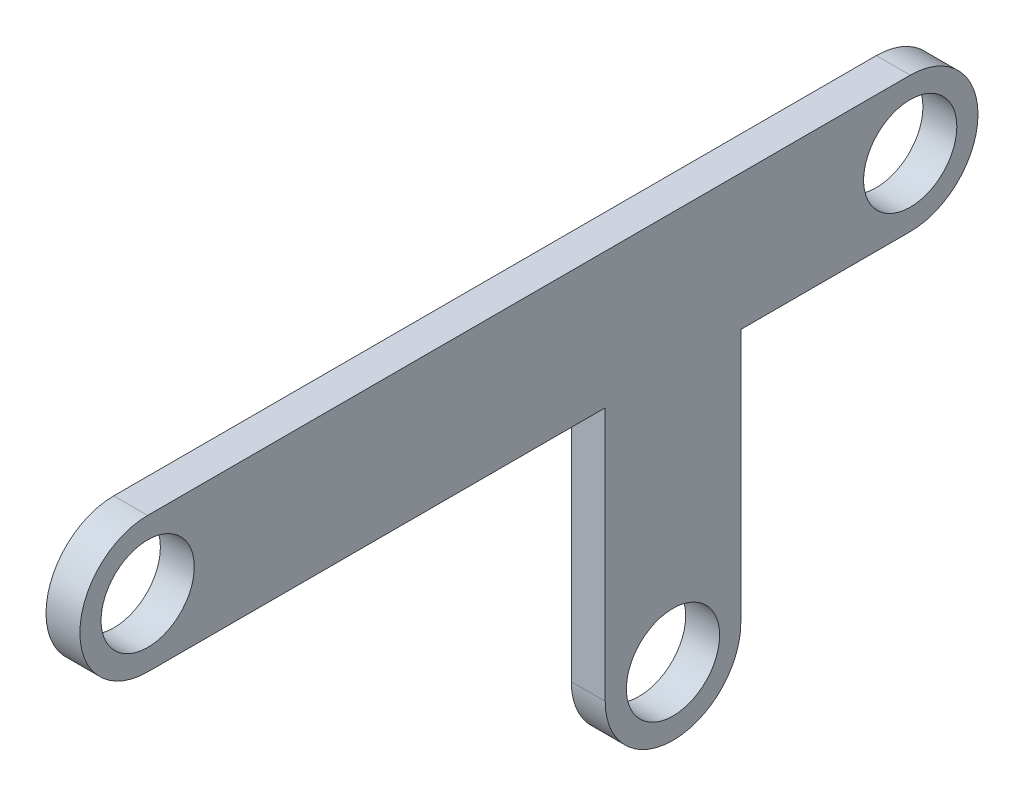
ISO-10303-21;
HEADER;
FILE_DESCRIPTION(('STEP AP214'),'2;1');
FILE_NAME('part.step','',(''),(''),'','','');
FILE_SCHEMA(('AUTOMOTIVE_DESIGN { 1 0 10303 214 1 1 1 1 }'));
ENDSEC;
DATA;
#1=APPLICATION_CONTEXT('core data for automotive mechanical design processes');
#2=APPLICATION_PROTOCOL_DEFINITION('international standard','automotive_design',2000,#1);
#3=PRODUCT_CONTEXT('',#1,'mechanical');
#4=PRODUCT('Part','Part','',(#3));
#5=PRODUCT_RELATED_PRODUCT_CATEGORY('part','',(#4));
#6=PRODUCT_DEFINITION_FORMATION('','',#4);
#7=PRODUCT_DEFINITION_CONTEXT('part definition',#1,'design');
#8=PRODUCT_DEFINITION('design','',#6,#7);
#9=PRODUCT_DEFINITION_SHAPE('','',#8);
#10=(LENGTH_UNIT() NAMED_UNIT(*) SI_UNIT(.MILLI.,.METRE.));
#11=(NAMED_UNIT(*) PLANE_ANGLE_UNIT() SI_UNIT($,.RADIAN.));
#12=(NAMED_UNIT(*) SI_UNIT($,.STERADIAN.) SOLID_ANGLE_UNIT());
#13=UNCERTAINTY_MEASURE_WITH_UNIT(LENGTH_MEASURE(1.E-05),#10,'distance_accuracy_value','');
#14=(GEOMETRIC_REPRESENTATION_CONTEXT(3) GLOBAL_UNCERTAINTY_ASSIGNED_CONTEXT((#13)) GLOBAL_UNIT_ASSIGNED_CONTEXT((#10,
#11,#12)) REPRESENTATION_CONTEXT('',''));
#15=CARTESIAN_POINT('',(0.,0.,0.));
#16=DIRECTION('',(0.,0.,1.));
#17=DIRECTION('',(1.,0.,0.));
#18=AXIS2_PLACEMENT_3D('',#15,#16,#17);
#19=CARTESIAN_POINT('',(2.,0.,-31.));
#20=DIRECTION('',(0.,0.,-1.));
#21=DIRECTION('',(0.,1.,0.));
#22=AXIS2_PLACEMENT_3D('',#19,#20,#21);
#23=PLANE('',#22);
#24=DIRECTION('',(0.,-1.,0.));
#25=VECTOR('',#24,1.);
#26=CARTESIAN_POINT('',(0.,0.,-31.));
#27=LINE('',#26,#25);
#28=CARTESIAN_POINT('',(0.,0.,-31.));
#29=VERTEX_POINT('',#28);
#30=CARTESIAN_POINT('',(0.,-15.,-31.));
#31=VERTEX_POINT('',#30);
#32=EDGE_CURVE('E162',#29,#31,#27,.T.);
#33=ORIENTED_EDGE('',*,*,#32,.T.);
#34=DIRECTION('',(-1.,0.,0.));
#35=VECTOR('',#34,1.);
#36=CARTESIAN_POINT('',(2.,-15.,-31.));
#37=LINE('',#36,#35);
#38=CARTESIAN_POINT('',(2.,-15.,-31.));
#39=VERTEX_POINT('',#38);
#40=EDGE_CURVE('E11',#39,#31,#37,.T.);
#41=ORIENTED_EDGE('',*,*,#40,.F.);
#42=DIRECTION('',(0.,-1.,0.));
#43=VECTOR('',#42,1.);
#44=CARTESIAN_POINT('',(2.,0.,-31.));
#45=LINE('',#44,#43);
#46=CARTESIAN_POINT('',(2.,0.,-31.));
#47=VERTEX_POINT('',#46);
#48=EDGE_CURVE('E222',#47,#39,#45,.T.);
#49=ORIENTED_EDGE('',*,*,#48,.F.);
#50=DIRECTION('',(-1.,0.,0.));
#51=VECTOR('',#50,1.);
#52=CARTESIAN_POINT('',(2.,0.,-31.));
#53=LINE('',#52,#51);
#54=EDGE_CURVE('E149',#47,#29,#53,.T.);
#55=ORIENTED_EDGE('',*,*,#54,.T.);
#56=EDGE_LOOP('',(#33,#41,#49,#55));
#57=FACE_BOUND('',#56,.T.);
#58=ADVANCED_FACE('F46',(#57),#23,.F.);
#59=CARTESIAN_POINT('',(2.,-15.,-35.));
#60=DIRECTION('',(-1.,0.,0.));
#61=DIRECTION('',(0.,0.,1.));
#62=AXIS2_PLACEMENT_3D('',#59,#60,#61);
#63=CYLINDRICAL_SURFACE('',#62,4.);
#64=CARTESIAN_POINT('',(0.,-15.,-35.));
#65=DIRECTION('',(1.,0.,0.));
#66=DIRECTION('',(0.,0.,-1.));
#67=AXIS2_PLACEMENT_3D('',#64,#65,#66);
#68=CIRCLE('',#67,4.);
#69=CARTESIAN_POINT('',(0.,-15.,-39.));
#70=VERTEX_POINT('',#69);
#71=EDGE_CURVE('E166',#31,#70,#68,.T.);
#72=ORIENTED_EDGE('',*,*,#71,.T.);
#73=DIRECTION('',(-1.,0.,0.));
#74=VECTOR('',#73,1.);
#75=CARTESIAN_POINT('',(2.,-15.,-39.));
#76=LINE('',#75,#74);
#77=CARTESIAN_POINT('',(2.,-15.,-39.));
#78=VERTEX_POINT('',#77);
#79=EDGE_CURVE('E56',#78,#70,#76,.T.);
#80=ORIENTED_EDGE('',*,*,#79,.F.);
#81=CARTESIAN_POINT('',(2.,-15.,-35.));
#82=DIRECTION('',(1.,0.,0.));
#83=DIRECTION('',(0.,0.,-1.));
#84=AXIS2_PLACEMENT_3D('',#81,#82,#83);
#85=CIRCLE('',#84,4.);
#86=EDGE_CURVE('E106',#39,#78,#85,.T.);
#87=ORIENTED_EDGE('',*,*,#86,.F.);
#88=ORIENTED_EDGE('',*,*,#40,.T.);
#89=EDGE_LOOP('',(#72,#80,#87,#88));
#90=FACE_BOUND('',#89,.T.);
#91=ADVANCED_FACE('F207',(#90),#63,.T.);
#92=CARTESIAN_POINT('',(2.,0.,-39.));
#93=DIRECTION('',(0.,0.,-1.));
#94=DIRECTION('',(-1.,0.,0.));
#95=AXIS2_PLACEMENT_3D('',#92,#93,#94);
#96=PLANE('',#95);
#97=DIRECTION('',(0.,-1.,0.));
#98=VECTOR('',#97,1.);
#99=CARTESIAN_POINT('',(0.,0.,-39.));
#100=LINE('',#99,#98);
#101=CARTESIAN_POINT('',(0.,0.,-39.));
#102=VERTEX_POINT('',#101);
#103=EDGE_CURVE('E170',#102,#70,#100,.T.);
#104=ORIENTED_EDGE('',*,*,#103,.F.);
#105=DIRECTION('',(-1.,0.,0.));
#106=VECTOR('',#105,1.);
#107=CARTESIAN_POINT('',(2.,0.,-39.));
#108=LINE('',#107,#106);
#109=CARTESIAN_POINT('',(2.,0.,-39.));
#110=VERTEX_POINT('',#109);
#111=EDGE_CURVE('E198',#110,#102,#108,.T.);
#112=ORIENTED_EDGE('',*,*,#111,.F.);
#113=DIRECTION('',(0.,-1.,0.));
#114=VECTOR('',#113,1.);
#115=CARTESIAN_POINT('',(2.,0.,-39.));
#116=LINE('',#115,#114);
#117=EDGE_CURVE('E206',#110,#78,#116,.T.);
#118=ORIENTED_EDGE('',*,*,#117,.T.);
#119=ORIENTED_EDGE('',*,*,#79,.T.);
#120=EDGE_LOOP('',(#104,#112,#118,#119));
#121=FACE_BOUND('',#120,.T.);
#122=ADVANCED_FACE('F204',(#121),#96,.T.);
#123=CARTESIAN_POINT('',(2.,0.,0.));
#124=DIRECTION('',(0.,1.,0.));
#125=DIRECTION('',(0.,0.,1.));
#126=AXIS2_PLACEMENT_3D('',#123,#124,#125);
#127=PLANE('',#126);
#128=DIRECTION('',(0.,0.,-1.));
#129=VECTOR('',#128,1.);
#130=CARTESIAN_POINT('',(0.,0.,0.));
#131=LINE('',#130,#129);
#132=CARTESIAN_POINT('',(0.,0.,-49.));
#133=VERTEX_POINT('',#132);
#134=EDGE_CURVE('E174',#102,#133,#131,.T.);
#135=ORIENTED_EDGE('',*,*,#134,.T.);
#136=DIRECTION('',(-1.,0.,0.));
#137=VECTOR('',#136,1.);
#138=CARTESIAN_POINT('',(2.,0.,-49.));
#139=LINE('',#138,#137);
#140=CARTESIAN_POINT('',(2.,0.,-49.));
#141=VERTEX_POINT('',#140);
#142=EDGE_CURVE('E194',#141,#133,#139,.T.);
#143=ORIENTED_EDGE('',*,*,#142,.F.);
#144=DIRECTION('',(0.,0.,-1.));
#145=VECTOR('',#144,1.);
#146=CARTESIAN_POINT('',(2.,0.,0.));
#147=LINE('',#146,#145);
#148=EDGE_CURVE('E143',#110,#141,#147,.T.);
#149=ORIENTED_EDGE('',*,*,#148,.F.);
#150=ORIENTED_EDGE('',*,*,#111,.T.);
#151=EDGE_LOOP('',(#135,#143,#149,#150));
#152=FACE_BOUND('',#151,.T.);
#153=ADVANCED_FACE('F216',(#152),#127,.F.);
#154=CARTESIAN_POINT('',(2.,4.,-49.));
#155=DIRECTION('',(-1.,0.,0.));
#156=DIRECTION('',(0.,0.,1.));
#157=AXIS2_PLACEMENT_3D('',#154,#155,#156);
#158=CYLINDRICAL_SURFACE('',#157,4.);
#159=CARTESIAN_POINT('',(0.,4.,-49.));
#160=DIRECTION('',(1.,0.,0.));
#161=DIRECTION('',(0.,0.,-1.));
#162=AXIS2_PLACEMENT_3D('',#159,#160,#161);
#163=CIRCLE('',#162,4.);
#164=CARTESIAN_POINT('',(0.,8.,-49.));
#165=VERTEX_POINT('',#164);
#166=EDGE_CURVE('E177',#133,#165,#163,.T.);
#167=ORIENTED_EDGE('',*,*,#166,.T.);
#168=DIRECTION('',(-1.,0.,0.));
#169=VECTOR('',#168,1.);
#170=CARTESIAN_POINT('',(2.,8.,-49.));
#171=LINE('',#170,#169);
#172=CARTESIAN_POINT('',(2.,8.,-49.));
#173=VERTEX_POINT('',#172);
#174=EDGE_CURVE('E129',#173,#165,#171,.T.);
#175=ORIENTED_EDGE('',*,*,#174,.F.);
#176=CARTESIAN_POINT('',(2.,4.,-49.));
#177=DIRECTION('',(1.,0.,0.));
#178=DIRECTION('',(0.,0.,-1.));
#179=AXIS2_PLACEMENT_3D('',#176,#177,#178);
#180=CIRCLE('',#179,4.);
#181=EDGE_CURVE('E138',#141,#173,#180,.T.);
#182=ORIENTED_EDGE('',*,*,#181,.F.);
#183=ORIENTED_EDGE('',*,*,#142,.T.);
#184=EDGE_LOOP('',(#167,#175,#182,#183));
#185=FACE_BOUND('',#184,.T.);
#186=ADVANCED_FACE('F219',(#185),#158,.T.);
#187=CARTESIAN_POINT('',(2.,8.,0.));
#188=DIRECTION('',(0.,1.,0.));
#189=DIRECTION('',(0.,0.,1.));
#190=AXIS2_PLACEMENT_3D('',#187,#188,#189);
#191=PLANE('',#190);
#192=DIRECTION('',(0.,0.,-1.));
#193=VECTOR('',#192,1.);
#194=CARTESIAN_POINT('',(0.,8.,0.));
#195=LINE('',#194,#193);
#196=CARTESIAN_POINT('',(0.,8.,-4.));
#197=VERTEX_POINT('',#196);
#198=EDGE_CURVE('E127',#197,#165,#195,.T.);
#199=ORIENTED_EDGE('',*,*,#198,.F.);
#200=DIRECTION('',(-1.,0.,0.));
#201=VECTOR('',#200,1.);
#202=CARTESIAN_POINT('',(2.,8.,-4.));
#203=LINE('',#202,#201);
#204=CARTESIAN_POINT('',(2.,8.,-4.));
#205=VERTEX_POINT('',#204);
#206=EDGE_CURVE('E121',#205,#197,#203,.T.);
#207=ORIENTED_EDGE('',*,*,#206,.F.);
#208=DIRECTION('',(0.,0.,-1.));
#209=VECTOR('',#208,1.);
#210=CARTESIAN_POINT('',(2.,8.,0.));
#211=LINE('',#210,#209);
#212=EDGE_CURVE('E125',#205,#173,#211,.T.);
#213=ORIENTED_EDGE('',*,*,#212,.T.);
#214=ORIENTED_EDGE('',*,*,#174,.T.);
#215=EDGE_LOOP('',(#199,#207,#213,#214));
#216=FACE_BOUND('',#215,.T.);
#217=ADVANCED_FACE('F123',(#216),#191,.T.);
#218=CARTESIAN_POINT('',(2.,4.,-4.));
#219=DIRECTION('',(-1.,0.,0.));
#220=DIRECTION('',(0.,0.,1.));
#221=AXIS2_PLACEMENT_3D('',#218,#219,#220);
#222=CYLINDRICAL_SURFACE('',#221,4.);
#223=CARTESIAN_POINT('',(0.,4.,-4.));
#224=DIRECTION('',(1.,0.,0.));
#225=DIRECTION('',(0.,0.,-1.));
#226=AXIS2_PLACEMENT_3D('',#223,#224,#225);
#227=CIRCLE('',#226,4.);
#228=CARTESIAN_POINT('',(0.,0.,-4.));
#229=VERTEX_POINT('',#228);
#230=EDGE_CURVE('E92',#197,#229,#227,.T.);
#231=ORIENTED_EDGE('',*,*,#230,.T.);
#232=DIRECTION('',(-1.,0.,0.));
#233=VECTOR('',#232,1.);
#234=CARTESIAN_POINT('',(2.,0.,-4.));
#235=LINE('',#234,#233);
#236=CARTESIAN_POINT('',(2.,0.,-4.));
#237=VERTEX_POINT('',#236);
#238=EDGE_CURVE('E130',#237,#229,#235,.T.);
#239=ORIENTED_EDGE('',*,*,#238,.F.);
#240=CARTESIAN_POINT('',(2.,4.,-4.));
#241=DIRECTION('',(1.,0.,0.));
#242=DIRECTION('',(0.,0.,-1.));
#243=AXIS2_PLACEMENT_3D('',#240,#241,#242);
#244=CIRCLE('',#243,4.);
#245=EDGE_CURVE('E132',#205,#237,#244,.T.);
#246=ORIENTED_EDGE('',*,*,#245,.F.);
#247=ORIENTED_EDGE('',*,*,#206,.T.);
#248=EDGE_LOOP('',(#231,#239,#246,#247));
#249=FACE_BOUND('',#248,.T.);
#250=ADVANCED_FACE('F133',(#249),#222,.T.);
#251=CARTESIAN_POINT('',(2.,4.,-49.));
#252=DIRECTION('',(-1.,0.,0.));
#253=DIRECTION('',(0.,0.,1.));
#254=AXIS2_PLACEMENT_3D('',#251,#252,#253);
#255=CYLINDRICAL_SURFACE('',#254,2.75);
#256=CARTESIAN_POINT('',(2.,4.,-49.));
#257=DIRECTION('',(1.,0.,0.));
#258=DIRECTION('',(0.,0.,-1.));
#259=AXIS2_PLACEMENT_3D('',#256,#257,#258);
#260=CIRCLE('',#259,2.75);
#261=CARTESIAN_POINT('',(2.,4.,-51.75));
#262=VERTEX_POINT('',#261);
#263=EDGE_CURVE('E352',#262,#262,#260,.T.);
#264=ORIENTED_EDGE('',*,*,#263,.T.);
#265=EDGE_LOOP('',(#264));
#266=FACE_BOUND('',#265,.T.);
#267=CARTESIAN_POINT('',(0.,4.,-49.));
#268=DIRECTION('',(1.,0.,0.));
#269=DIRECTION('',(0.,0.,-1.));
#270=AXIS2_PLACEMENT_3D('',#267,#268,#269);
#271=CIRCLE('',#270,2.75);
#272=CARTESIAN_POINT('',(0.,4.,-51.75));
#273=VERTEX_POINT('',#272);
#274=EDGE_CURVE('E158',#273,#273,#271,.T.);
#275=ORIENTED_EDGE('',*,*,#274,.F.);
#276=EDGE_LOOP('',(#275));
#277=FACE_BOUND('',#276,.T.);
#278=ADVANCED_FACE('F244',(#266,#277),#255,.F.);
#279=CARTESIAN_POINT('',(2.,-15.,-35.));
#280=DIRECTION('',(-1.,0.,0.));
#281=DIRECTION('',(0.,0.,1.));
#282=AXIS2_PLACEMENT_3D('',#279,#280,#281);
#283=CYLINDRICAL_SURFACE('',#282,2.74999999999999);
#284=CARTESIAN_POINT('',(2.,-15.,-35.));
#285=DIRECTION('',(1.,0.,0.));
#286=DIRECTION('',(0.,0.,-1.));
#287=AXIS2_PLACEMENT_3D('',#284,#285,#286);
#288=CIRCLE('',#287,2.74999999999999);
#289=CARTESIAN_POINT('',(2.,-15.,-37.75));
#290=VERTEX_POINT('',#289);
#291=EDGE_CURVE('E254',#290,#290,#288,.T.);
#292=ORIENTED_EDGE('',*,*,#291,.T.);
#293=EDGE_LOOP('',(#292));
#294=FACE_BOUND('',#293,.T.);
#295=CARTESIAN_POINT('',(0.,-15.,-35.));
#296=DIRECTION('',(1.,0.,0.));
#297=DIRECTION('',(0.,0.,-1.));
#298=AXIS2_PLACEMENT_3D('',#295,#296,#297);
#299=CIRCLE('',#298,2.74999999999999);
#300=CARTESIAN_POINT('',(0.,-15.,-37.75));
#301=VERTEX_POINT('',#300);
#302=EDGE_CURVE('E154',#301,#301,#299,.T.);
#303=ORIENTED_EDGE('',*,*,#302,.F.);
#304=EDGE_LOOP('',(#303));
#305=FACE_BOUND('',#304,.T.);
#306=ADVANCED_FACE('F232',(#294,#305),#283,.F.);
#307=CARTESIAN_POINT('',(2.,4.,-4.));
#308=DIRECTION('',(-1.,0.,0.));
#309=DIRECTION('',(0.,0.,1.));
#310=AXIS2_PLACEMENT_3D('',#307,#308,#309);
#311=CYLINDRICAL_SURFACE('',#310,2.75);
#312=CARTESIAN_POINT('',(2.,4.,-4.));
#313=DIRECTION('',(1.,0.,0.));
#314=DIRECTION('',(0.,0.,-1.));
#315=AXIS2_PLACEMENT_3D('',#312,#313,#314);
#316=CIRCLE('',#315,2.75);
#317=CARTESIAN_POINT('',(2.,4.,-6.75));
#318=VERTEX_POINT('',#317);
#319=EDGE_CURVE('E187',#318,#318,#316,.T.);
#320=ORIENTED_EDGE('',*,*,#319,.T.);
#321=EDGE_LOOP('',(#320));
#322=FACE_BOUND('',#321,.T.);
#323=CARTESIAN_POINT('',(0.,4.,-4.));
#324=DIRECTION('',(1.,0.,0.));
#325=DIRECTION('',(0.,0.,-1.));
#326=AXIS2_PLACEMENT_3D('',#323,#324,#325);
#327=CIRCLE('',#326,2.75);
#328=CARTESIAN_POINT('',(0.,4.,-6.75));
#329=VERTEX_POINT('',#328);
#330=EDGE_CURVE('E150',#329,#329,#327,.T.);
#331=ORIENTED_EDGE('',*,*,#330,.F.);
#332=EDGE_LOOP('',(#331));
#333=FACE_BOUND('',#332,.T.);
#334=ADVANCED_FACE('F48',(#322,#333),#311,.F.);
#335=CARTESIAN_POINT('',(2.,0.,0.));
#336=DIRECTION('',(0.,1.,0.));
#337=DIRECTION('',(0.,0.,1.));
#338=AXIS2_PLACEMENT_3D('',#335,#336,#337);
#339=PLANE('',#338);
#340=DIRECTION('',(0.,0.,-1.));
#341=VECTOR('',#340,1.);
#342=CARTESIAN_POINT('',(0.,0.,0.));
#343=LINE('',#342,#341);
#344=EDGE_CURVE('E98',#229,#29,#343,.T.);
#345=ORIENTED_EDGE('',*,*,#344,.T.);
#346=ORIENTED_EDGE('',*,*,#54,.F.);
#347=DIRECTION('',(0.,0.,-1.));
#348=VECTOR('',#347,1.);
#349=CARTESIAN_POINT('',(2.,0.,0.));
#350=LINE('',#349,#348);
#351=EDGE_CURVE('E64',#237,#47,#350,.T.);
#352=ORIENTED_EDGE('',*,*,#351,.F.);
#353=ORIENTED_EDGE('',*,*,#238,.T.);
#354=EDGE_LOOP('',(#345,#346,#352,#353));
#355=FACE_BOUND('',#354,.T.);
#356=ADVANCED_FACE('F223',(#355),#339,.F.);
#357=CARTESIAN_POINT('',(2.,0.,0.));
#358=DIRECTION('',(1.,0.,0.));
#359=DIRECTION('',(0.,0.,-1.));
#360=AXIS2_PLACEMENT_3D('',#357,#358,#359);
#361=PLANE('',#360);
#362=ORIENTED_EDGE('',*,*,#319,.F.);
#363=EDGE_LOOP('',(#362));
#364=FACE_BOUND('',#363,.T.);
#365=ORIENTED_EDGE('',*,*,#291,.F.);
#366=EDGE_LOOP('',(#365));
#367=FACE_BOUND('',#366,.T.);
#368=ORIENTED_EDGE('',*,*,#263,.F.);
#369=EDGE_LOOP('',(#368));
#370=FACE_BOUND('',#369,.T.);
#371=ORIENTED_EDGE('',*,*,#48,.T.);
#372=ORIENTED_EDGE('',*,*,#86,.T.);
#373=ORIENTED_EDGE('',*,*,#117,.F.);
#374=ORIENTED_EDGE('',*,*,#148,.T.);
#375=ORIENTED_EDGE('',*,*,#181,.T.);
#376=ORIENTED_EDGE('',*,*,#212,.F.);
#377=ORIENTED_EDGE('',*,*,#245,.T.);
#378=ORIENTED_EDGE('',*,*,#351,.T.);
#379=EDGE_LOOP('',(#371,#372,#373,#374,#375,#376,#377,#378));
#380=FACE_BOUND('',#379,.T.);
#381=ADVANCED_FACE('F136',(#364,#367,#370,#380),#361,.T.);
#382=CARTESIAN_POINT('',(0.,0.,0.));
#383=DIRECTION('',(1.,0.,0.));
#384=DIRECTION('',(0.,0.,-1.));
#385=AXIS2_PLACEMENT_3D('',#382,#383,#384);
#386=PLANE('',#385);
#387=ORIENTED_EDGE('',*,*,#330,.T.);
#388=EDGE_LOOP('',(#387));
#389=FACE_BOUND('',#388,.T.);
#390=ORIENTED_EDGE('',*,*,#302,.T.);
#391=EDGE_LOOP('',(#390));
#392=FACE_BOUND('',#391,.T.);
#393=ORIENTED_EDGE('',*,*,#274,.T.);
#394=EDGE_LOOP('',(#393));
#395=FACE_BOUND('',#394,.T.);
#396=ORIENTED_EDGE('',*,*,#32,.F.);
#397=ORIENTED_EDGE('',*,*,#344,.F.);
#398=ORIENTED_EDGE('',*,*,#230,.F.);
#399=ORIENTED_EDGE('',*,*,#198,.T.);
#400=ORIENTED_EDGE('',*,*,#166,.F.);
#401=ORIENTED_EDGE('',*,*,#134,.F.);
#402=ORIENTED_EDGE('',*,*,#103,.T.);
#403=ORIENTED_EDGE('',*,*,#71,.F.);
#404=EDGE_LOOP('',(#396,#397,#398,#399,#400,#401,#402,#403));
#405=FACE_BOUND('',#404,.T.);
#406=ADVANCED_FACE('F212',(#389,#392,#395,#405),#386,.F.);
#407=CLOSED_SHELL('',(#58,#91,#122,#153,#186,#217,#250,#278,#306,#334,#356,#381,#406));
#408=MANIFOLD_SOLID_BREP('B2',#407);
#409=ADVANCED_BREP_SHAPE_REPRESENTATION('',(#18,#408),#14);
#410=SHAPE_DEFINITION_REPRESENTATION(#9,#409);
ENDSEC;
END-ISO-10303-21;
